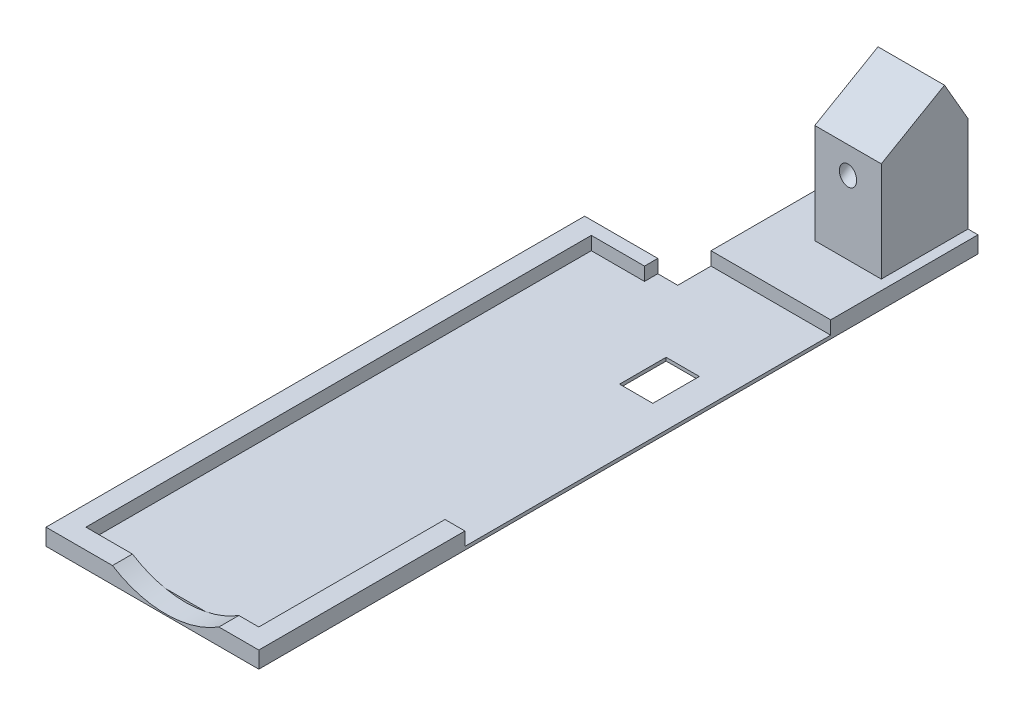
ISO-10303-21;
HEADER;
FILE_DESCRIPTION(('STEP AP214'),'2;1');
FILE_NAME('part.step','',(''),(''),'','','');
FILE_SCHEMA(('AUTOMOTIVE_DESIGN { 1 0 10303 214 1 1 1 1 }'));
ENDSEC;
DATA;
#1=APPLICATION_CONTEXT('core data for automotive mechanical design processes');
#2=APPLICATION_PROTOCOL_DEFINITION('international standard','automotive_design',2000,#1);
#3=PRODUCT_CONTEXT('',#1,'mechanical');
#4=PRODUCT('Part','Part','',(#3));
#5=PRODUCT_RELATED_PRODUCT_CATEGORY('part','',(#4));
#6=PRODUCT_DEFINITION_FORMATION('','',#4);
#7=PRODUCT_DEFINITION_CONTEXT('part definition',#1,'design');
#8=PRODUCT_DEFINITION('design','',#6,#7);
#9=PRODUCT_DEFINITION_SHAPE('','',#8);
#10=(LENGTH_UNIT() NAMED_UNIT(*) SI_UNIT(.MILLI.,.METRE.));
#11=(NAMED_UNIT(*) PLANE_ANGLE_UNIT() SI_UNIT($,.RADIAN.));
#12=(NAMED_UNIT(*) SI_UNIT($,.STERADIAN.) SOLID_ANGLE_UNIT());
#13=UNCERTAINTY_MEASURE_WITH_UNIT(LENGTH_MEASURE(1.E-05),#10,'distance_accuracy_value','');
#14=(GEOMETRIC_REPRESENTATION_CONTEXT(3) GLOBAL_UNCERTAINTY_ASSIGNED_CONTEXT((#13)) GLOBAL_UNIT_ASSIGNED_CONTEXT((#10,
#11,#12)) REPRESENTATION_CONTEXT('',''));
#15=CARTESIAN_POINT('',(0.,0.,0.));
#16=DIRECTION('',(0.,0.,1.));
#17=DIRECTION('',(1.,0.,0.));
#18=AXIS2_PLACEMENT_3D('',#15,#16,#17);
#19=CARTESIAN_POINT('',(0.,0.,0.));
#20=DIRECTION('',(0.,-1.,0.));
#21=DIRECTION('',(0.,0.,-1.));
#22=AXIS2_PLACEMENT_3D('',#19,#20,#21);
#23=PLANE('',#22);
#24=DIRECTION('',(0.,0.,1.));
#25=VECTOR('',#24,1.);
#26=CARTESIAN_POINT('',(11.5,0.,-32.15));
#27=LINE('',#26,#25);
#28=CARTESIAN_POINT('',(11.5,0.,45.));
#29=VERTEX_POINT('',#28);
#30=CARTESIAN_POINT('',(11.5,0.,76.));
#31=VERTEX_POINT('',#30);
#32=EDGE_CURVE('E322',#29,#31,#27,.T.);
#33=ORIENTED_EDGE('',*,*,#32,.F.);
#34=DIRECTION('',(1.,0.,0.));
#35=VECTOR('',#34,1.);
#36=CARTESIAN_POINT('',(11.5,0.,45.));
#37=LINE('',#36,#35);
#38=CARTESIAN_POINT('',(8.50000000000001,0.,45.));
#39=VERTEX_POINT('',#38);
#40=EDGE_CURVE('E231',#39,#29,#37,.T.);
#41=ORIENTED_EDGE('',*,*,#40,.F.);
#42=DIRECTION('',(0.,0.,-1.));
#43=VECTOR('',#42,1.);
#44=CARTESIAN_POINT('',(8.5,0.,-3.));
#45=LINE('',#44,#43);
#46=CARTESIAN_POINT('',(8.50000000000003,0.,73.));
#47=VERTEX_POINT('',#46);
#48=EDGE_CURVE('E315',#47,#39,#45,.T.);
#49=ORIENTED_EDGE('',*,*,#48,.F.);
#50=DIRECTION('',(1.,0.,0.));
#51=VECTOR('',#50,1.);
#52=CARTESIAN_POINT('',(8.50000000000003,0.,73.));
#53=LINE('',#52,#51);
#54=CARTESIAN_POINT('',(5.50000000000001,0.,73.));
#55=VERTEX_POINT('',#54);
#56=EDGE_CURVE('E311',#55,#47,#53,.T.);
#57=ORIENTED_EDGE('',*,*,#56,.F.);
#58=DIRECTION('',(0.,0.,-1.));
#59=VECTOR('',#58,1.);
#60=CARTESIAN_POINT('',(5.50000000000001,0.,78.));
#61=LINE('',#60,#59);
#62=CARTESIAN_POINT('',(5.50000000000001,0.,76.));
#63=VERTEX_POINT('',#62);
#64=EDGE_CURVE('E262',#63,#55,#61,.T.);
#65=ORIENTED_EDGE('',*,*,#64,.F.);
#66=DIRECTION('',(-1.,0.,0.));
#67=VECTOR('',#66,1.);
#68=CARTESIAN_POINT('',(11.5,0.,76.));
#69=LINE('',#68,#67);
#70=EDGE_CURVE('E345',#31,#63,#69,.T.);
#71=ORIENTED_EDGE('',*,*,#70,.F.);
#72=EDGE_LOOP('',(#33,#41,#49,#57,#65,#71));
#73=FACE_BOUND('',#72,.T.);
#74=ADVANCED_FACE('F32',(#73),#23,.F.);
#75=DIRECTION('',(-1.,0.,0.));
#76=VECTOR('',#75,1.);
#77=CARTESIAN_POINT('',(8.5,0.,-3.));
#78=LINE('',#77,#76);
#79=CARTESIAN_POINT('',(-9.5,0.,-3.));
#80=VERTEX_POINT('',#79);
#81=CARTESIAN_POINT('',(-17.5,0.,-3.));
#82=VERTEX_POINT('',#81);
#83=EDGE_CURVE('E300',#80,#82,#78,.T.);
#84=ORIENTED_EDGE('',*,*,#83,.F.);
#85=DIRECTION('',(0.,0.,1.));
#86=VECTOR('',#85,1.);
#87=CARTESIAN_POINT('',(-9.5,0.,-10.));
#88=LINE('',#87,#86);
#89=CARTESIAN_POINT('',(-9.5,0.,-5.));
#90=VERTEX_POINT('',#89);
#91=EDGE_CURVE('E539',#90,#80,#88,.T.);
#92=ORIENTED_EDGE('',*,*,#91,.F.);
#93=DIRECTION('',(1.,0.,0.));
#94=VECTOR('',#93,1.);
#95=CARTESIAN_POINT('',(-20.5,0.,-5.));
#96=LINE('',#95,#94);
#97=CARTESIAN_POINT('',(-20.5,0.,-5.));
#98=VERTEX_POINT('',#97);
#99=EDGE_CURVE('E350',#98,#90,#96,.T.);
#100=ORIENTED_EDGE('',*,*,#99,.F.);
#101=DIRECTION('',(0.,0.,-1.));
#102=VECTOR('',#101,1.);
#103=CARTESIAN_POINT('',(-20.5,0.,-5.));
#104=LINE('',#103,#102);
#105=CARTESIAN_POINT('',(-20.5,0.,76.));
#106=VERTEX_POINT('',#105);
#107=EDGE_CURVE('E348',#106,#98,#104,.T.);
#108=ORIENTED_EDGE('',*,*,#107,.F.);
#109=CARTESIAN_POINT('',(-10.5,0.,76.));
#110=VERTEX_POINT('',#109);
#111=EDGE_CURVE('E344',#110,#106,#69,.T.);
#112=ORIENTED_EDGE('',*,*,#111,.F.);
#113=DIRECTION('',(0.,0.,-1.));
#114=VECTOR('',#113,1.);
#115=CARTESIAN_POINT('',(-10.5,0.,78.));
#116=LINE('',#115,#114);
#117=CARTESIAN_POINT('',(-10.5,0.,73.));
#118=VERTEX_POINT('',#117);
#119=EDGE_CURVE('E260',#110,#118,#116,.T.);
#120=ORIENTED_EDGE('',*,*,#119,.T.);
#121=CARTESIAN_POINT('',(-17.5,0.,73.));
#122=VERTEX_POINT('',#121);
#123=EDGE_CURVE('E312',#122,#118,#53,.T.);
#124=ORIENTED_EDGE('',*,*,#123,.F.);
#125=DIRECTION('',(0.,0.,1.));
#126=VECTOR('',#125,1.);
#127=CARTESIAN_POINT('',(-17.5,0.,-3.));
#128=LINE('',#127,#126);
#129=EDGE_CURVE('E295',#82,#122,#128,.T.);
#130=ORIENTED_EDGE('',*,*,#129,.F.);
#131=EDGE_LOOP('',(#84,#92,#100,#108,#112,#120,#124,#130));
#132=FACE_BOUND('',#131,.T.);
#133=ADVANCED_FACE('F428',(#132),#23,.F.);
#134=CARTESIAN_POINT('',(8.50000000000003,-2.,73.));
#135=DIRECTION('',(0.,0.,1.));
#136=DIRECTION('',(1.,0.,0.));
#137=AXIS2_PLACEMENT_3D('',#134,#135,#136);
#138=PLANE('',#137);
#139=ORIENTED_EDGE('',*,*,#123,.T.);
#140=CARTESIAN_POINT('',(-2.49999999999999,12.6885775404495,73.));
#141=DIRECTION('',(0.,0.,-1.));
#142=DIRECTION('',(1.,0.,0.));
#143=AXIS2_PLACEMENT_3D('',#140,#141,#142);
#144=CIRCLE('',#143,15.);
#145=CARTESIAN_POINT('',(-5.54067259635132,-2.,73.));
#146=VERTEX_POINT('',#145);
#147=EDGE_CURVE('E258',#146,#118,#144,.T.);
#148=ORIENTED_EDGE('',*,*,#147,.F.);
#149=DIRECTION('',(1.,0.,0.));
#150=VECTOR('',#149,1.);
#151=CARTESIAN_POINT('',(8.50000000000003,-2.,73.));
#152=LINE('',#151,#150);
#153=CARTESIAN_POINT('',(-17.5,-2.,73.));
#154=VERTEX_POINT('',#153);
#155=EDGE_CURVE('E301',#154,#146,#152,.T.);
#156=ORIENTED_EDGE('',*,*,#155,.F.);
#157=DIRECTION('',(0.,1.,0.));
#158=VECTOR('',#157,1.);
#159=CARTESIAN_POINT('',(-17.5,-2.,73.));
#160=LINE('',#159,#158);
#161=EDGE_CURVE('E309',#154,#122,#160,.T.);
#162=ORIENTED_EDGE('',*,*,#161,.T.);
#163=EDGE_LOOP('',(#139,#148,#156,#162));
#164=FACE_BOUND('',#163,.T.);
#165=ADVANCED_FACE('F437',(#164),#138,.F.);
#166=CARTESIAN_POINT('',(10.,20.5,-28.6147367081371));
#167=DIRECTION('',(0.,-0.500000000000002,0.866025403784438));
#168=DIRECTION('',(0.,-0.866025403784438,-0.500000000000002));
#169=AXIS2_PLACEMENT_3D('',#166,#167,#168);
#170=PLANE('',#169);
#171=CARTESIAN_POINT('',(5.,17.4689110867545,-30.3647367081371));
#172=DIRECTION('',(0.,0.500000000000001,-0.866025403784438));
#173=DIRECTION('',(0.,0.866025403784438,0.500000000000001));
#174=AXIS2_PLACEMENT_3D('',#171,#172,#173);
#175=CIRCLE('',#174,1.75);
#176=CARTESIAN_POINT('',(5.,18.9844555433773,-29.4897367081371));
#177=VERTEX_POINT('',#176);
#178=EDGE_CURVE('E372',#177,#177,#175,.T.);
#179=ORIENTED_EDGE('',*,*,#178,.F.);
#180=EDGE_LOOP('',(#179));
#181=FACE_BOUND('',#180,.T.);
#182=DIRECTION('',(0.,0.866025403784438,0.500000000000002));
#183=VECTOR('',#182,1.);
#184=CARTESIAN_POINT('',(0.,20.5,-28.6147367081371));
#185=LINE('',#184,#183);
#186=CARTESIAN_POINT('',(0.,14.3772003952441,-32.1497367081371));
#187=VERTEX_POINT('',#186);
#188=CARTESIAN_POINT('',(0.,20.5,-28.6147367081371));
#189=VERTEX_POINT('',#188);
#190=EDGE_CURVE('E389',#187,#189,#185,.T.);
#191=ORIENTED_EDGE('',*,*,#190,.T.);
#192=DIRECTION('',(-1.,0.,0.));
#193=VECTOR('',#192,1.);
#194=CARTESIAN_POINT('',(10.,20.5,-28.6147367081371));
#195=LINE('',#194,#193);
#196=CARTESIAN_POINT('',(10.,20.5,-28.6147367081371));
#197=VERTEX_POINT('',#196);
#198=EDGE_CURVE('E40',#197,#189,#195,.T.);
#199=ORIENTED_EDGE('',*,*,#198,.F.);
#200=DIRECTION('',(0.,0.866025403784438,0.500000000000002));
#201=VECTOR('',#200,1.);
#202=CARTESIAN_POINT('',(10.,20.5,-28.6147367081371));
#203=LINE('',#202,#201);
#204=CARTESIAN_POINT('',(10.,14.3772003952441,-32.1497367081371));
#205=VERTEX_POINT('',#204);
#206=EDGE_CURVE('E376',#205,#197,#203,.T.);
#207=ORIENTED_EDGE('',*,*,#206,.F.);
#208=DIRECTION('',(-1.,0.,0.));
#209=VECTOR('',#208,1.);
#210=CARTESIAN_POINT('',(10.,14.3772003952441,-32.1497367081371));
#211=LINE('',#210,#209);
#212=EDGE_CURVE('E388',#205,#187,#211,.T.);
#213=ORIENTED_EDGE('',*,*,#212,.T.);
#214=EDGE_LOOP('',(#191,#199,#207,#213));
#215=FACE_BOUND('',#214,.T.);
#216=ADVANCED_FACE('F477',(#181,#215),#170,.F.);
#217=CARTESIAN_POINT('',(10.,15.0101950089539,-19.10611554));
#218=DIRECTION('',(0.,-0.866025403784438,-0.500000000000001));
#219=DIRECTION('',(0.,0.500000000000001,-0.866025403784438));
#220=AXIS2_PLACEMENT_3D('',#217,#218,#219);
#221=PLANE('',#220);
#222=DIRECTION('',(0.,-0.500000000000001,0.866025403784438));
#223=VECTOR('',#222,1.);
#224=CARTESIAN_POINT('',(0.,15.0101950089539,-19.10611554));
#225=LINE('',#224,#223);
#226=CARTESIAN_POINT('',(0.,15.0101950089539,-19.10611554));
#227=VERTEX_POINT('',#226);
#228=EDGE_CURVE('E392',#189,#227,#225,.T.);
#229=ORIENTED_EDGE('',*,*,#228,.T.);
#230=DIRECTION('',(-1.,0.,0.));
#231=VECTOR('',#230,1.);
#232=CARTESIAN_POINT('',(10.,15.0101950089539,-19.10611554));
#233=LINE('',#232,#231);
#234=CARTESIAN_POINT('',(10.,15.0101950089539,-19.10611554));
#235=VERTEX_POINT('',#234);
#236=EDGE_CURVE('E408',#235,#227,#233,.T.);
#237=ORIENTED_EDGE('',*,*,#236,.F.);
#238=DIRECTION('',(0.,-0.500000000000001,0.866025403784438));
#239=VECTOR('',#238,1.);
#240=CARTESIAN_POINT('',(10.,15.0101950089539,-19.10611554));
#241=LINE('',#240,#239);
#242=EDGE_CURVE('E379',#197,#235,#241,.T.);
#243=ORIENTED_EDGE('',*,*,#242,.F.);
#244=ORIENTED_EDGE('',*,*,#198,.T.);
#245=EDGE_LOOP('',(#229,#237,#243,#244));
#246=FACE_BOUND('',#245,.T.);
#247=ADVANCED_FACE('F475',(#246),#221,.F.);
#248=CARTESIAN_POINT('',(10.,15.0101950089539,-19.10611554));
#249=DIRECTION('',(0.,0.,-1.));
#250=DIRECTION('',(0.,1.,0.));
#251=AXIS2_PLACEMENT_3D('',#248,#249,#250);
#252=PLANE('',#251);
#253=CARTESIAN_POINT('',(5.,10.9989273641986,-19.10611554));
#254=DIRECTION('',(0.,0.,-1.));
#255=DIRECTION('',(0.,1.,0.));
#256=AXIS2_PLACEMENT_3D('',#253,#254,#255);
#257=ELLIPSE('',#256,1.4971215493728,1.29628175330766);
#258=CARTESIAN_POINT('',(5.,12.4960489135714,-19.10611554));
#259=VERTEX_POINT('',#258);
#260=EDGE_CURVE('E375',#259,#259,#257,.T.);
#261=ORIENTED_EDGE('',*,*,#260,.T.);
#262=EDGE_LOOP('',(#261));
#263=FACE_BOUND('',#262,.T.);
#264=DIRECTION('',(0.,-1.,0.));
#265=VECTOR('',#264,1.);
#266=CARTESIAN_POINT('',(0.,15.0101950089539,-19.10611554));
#267=LINE('',#266,#265);
#268=CARTESIAN_POINT('',(0.,0.,-19.10611554));
#269=VERTEX_POINT('',#268);
#270=EDGE_CURVE('E394',#227,#269,#267,.T.);
#271=ORIENTED_EDGE('',*,*,#270,.T.);
#272=DIRECTION('',(-1.,0.,0.));
#273=VECTOR('',#272,1.);
#274=CARTESIAN_POINT('',(10.,0.,-19.10611554));
#275=LINE('',#274,#273);
#276=CARTESIAN_POINT('',(10.,0.,-19.10611554));
#277=VERTEX_POINT('',#276);
#278=EDGE_CURVE('E405',#277,#269,#275,.T.);
#279=ORIENTED_EDGE('',*,*,#278,.F.);
#280=DIRECTION('',(0.,-1.,0.));
#281=VECTOR('',#280,1.);
#282=CARTESIAN_POINT('',(10.,15.0101950089539,-19.10611554));
#283=LINE('',#282,#281);
#284=EDGE_CURVE('E382',#235,#277,#283,.T.);
#285=ORIENTED_EDGE('',*,*,#284,.F.);
#286=ORIENTED_EDGE('',*,*,#236,.T.);
#287=EDGE_LOOP('',(#271,#279,#285,#286));
#288=FACE_BOUND('',#287,.T.);
#289=ADVANCED_FACE('F415',(#263,#288),#252,.F.);
#290=CARTESIAN_POINT('',(10.,14.3772003952441,-32.1497367081371));
#291=DIRECTION('',(0.,0.,1.));
#292=DIRECTION('',(0.,-1.,0.));
#293=AXIS2_PLACEMENT_3D('',#290,#291,#292);
#294=PLANE('',#293);
#295=DIRECTION('',(0.,1.,0.));
#296=VECTOR('',#295,1.);
#297=CARTESIAN_POINT('',(0.,14.3772003952441,-32.1497367081371));
#298=LINE('',#297,#296);
#299=CARTESIAN_POINT('',(0.,0.,-32.1497367081371));
#300=VERTEX_POINT('',#299);
#301=EDGE_CURVE('E380',#300,#187,#298,.T.);
#302=ORIENTED_EDGE('',*,*,#301,.T.);
#303=ORIENTED_EDGE('',*,*,#212,.F.);
#304=DIRECTION('',(0.,1.,0.));
#305=VECTOR('',#304,1.);
#306=CARTESIAN_POINT('',(10.,14.3772003952441,-32.1497367081371));
#307=LINE('',#306,#305);
#308=CARTESIAN_POINT('',(10.,0.,-32.1497367081371));
#309=VERTEX_POINT('',#308);
#310=EDGE_CURVE('E386',#309,#205,#307,.T.);
#311=ORIENTED_EDGE('',*,*,#310,.F.);
#312=DIRECTION('',(-1.,0.,0.));
#313=VECTOR('',#312,1.);
#314=CARTESIAN_POINT('',(10.,0.,-32.1497367081371));
#315=LINE('',#314,#313);
#316=EDGE_CURVE('E403',#309,#300,#315,.T.);
#317=ORIENTED_EDGE('',*,*,#316,.T.);
#318=EDGE_LOOP('',(#302,#303,#311,#317));
#319=FACE_BOUND('',#318,.T.);
#320=ADVANCED_FACE('F467',(#319),#294,.F.);
#321=CARTESIAN_POINT('',(10.,0.,0.));
#322=DIRECTION('',(1.,0.,0.));
#323=DIRECTION('',(0.,0.,-1.));
#324=AXIS2_PLACEMENT_3D('',#321,#322,#323);
#325=PLANE('',#324);
#326=ORIENTED_EDGE('',*,*,#206,.T.);
#327=ORIENTED_EDGE('',*,*,#242,.T.);
#328=ORIENTED_EDGE('',*,*,#284,.T.);
#329=DIRECTION('',(0.,0.,-1.));
#330=VECTOR('',#329,1.);
#331=CARTESIAN_POINT('',(10.,0.,-32.1497367081371));
#332=LINE('',#331,#330);
#333=EDGE_CURVE('E384',#277,#309,#332,.T.);
#334=ORIENTED_EDGE('',*,*,#333,.T.);
#335=ORIENTED_EDGE('',*,*,#310,.T.);
#336=EDGE_LOOP('',(#326,#327,#328,#334,#335));
#337=FACE_BOUND('',#336,.T.);
#338=ADVANCED_FACE('F429',(#337),#325,.T.);
#339=CARTESIAN_POINT('',(0.,0.,0.));
#340=DIRECTION('',(1.,0.,0.));
#341=DIRECTION('',(0.,0.,-1.));
#342=AXIS2_PLACEMENT_3D('',#339,#340,#341);
#343=PLANE('',#342);
#344=ORIENTED_EDGE('',*,*,#190,.F.);
#345=ORIENTED_EDGE('',*,*,#301,.F.);
#346=DIRECTION('',(0.,0.,-1.));
#347=VECTOR('',#346,1.);
#348=CARTESIAN_POINT('',(0.,0.,-32.1497367081371));
#349=LINE('',#348,#347);
#350=EDGE_CURVE('E397',#269,#300,#349,.T.);
#351=ORIENTED_EDGE('',*,*,#350,.F.);
#352=ORIENTED_EDGE('',*,*,#270,.F.);
#353=ORIENTED_EDGE('',*,*,#228,.F.);
#354=EDGE_LOOP('',(#344,#345,#351,#352,#353));
#355=FACE_BOUND('',#354,.T.);
#356=ADVANCED_FACE('F420',(#355),#343,.F.);
#357=CARTESIAN_POINT('',(5.,17.4689110867545,-30.3647367081371));
#358=DIRECTION('',(0.,0.500000000000002,-0.866025403784438));
#359=DIRECTION('',(0.,0.866025403784438,0.500000000000001));
#360=AXIS2_PLACEMENT_3D('',#357,#358,#359);
#361=CONICAL_SURFACE('',#360,1.75,0.0349065850398866);
#362=ORIENTED_EDGE('',*,*,#178,.T.);
#363=EDGE_LOOP('',(#362));
#364=FACE_BOUND('',#363,.T.);
#365=ORIENTED_EDGE('',*,*,#260,.F.);
#366=EDGE_LOOP('',(#365));
#367=FACE_BOUND('',#366,.T.);
#368=ADVANCED_FACE('F34',(#364,#367),#361,.F.);
#369=DIRECTION('',(0.,0.,-1.));
#370=VECTOR('',#369,1.);
#371=CARTESIAN_POINT('',(-6.5,0.,-5.));
#372=LINE('',#371,#370);
#373=CARTESIAN_POINT('',(-6.5,0.,-10.));
#374=VERTEX_POINT('',#373);
#375=CARTESIAN_POINT('',(-6.5,0.,-32.15));
#376=VERTEX_POINT('',#375);
#377=EDGE_CURVE('E353',#374,#376,#372,.T.);
#378=ORIENTED_EDGE('',*,*,#377,.F.);
#379=DIRECTION('',(-1.,0.,0.));
#380=VECTOR('',#379,1.);
#381=CARTESIAN_POINT('',(11.5,0.,-10.));
#382=LINE('',#381,#380);
#383=CARTESIAN_POINT('',(11.5,0.,-10.));
#384=VERTEX_POINT('',#383);
#385=EDGE_CURVE('E540',#384,#374,#382,.T.);
#386=ORIENTED_EDGE('',*,*,#385,.F.);
#387=CARTESIAN_POINT('',(11.5,0.,-32.15));
#388=VERTEX_POINT('',#387);
#389=EDGE_CURVE('E237',#388,#384,#27,.T.);
#390=ORIENTED_EDGE('',*,*,#389,.F.);
#391=DIRECTION('',(1.,0.,0.));
#392=VECTOR('',#391,1.);
#393=CARTESIAN_POINT('',(-6.5,0.,-32.15));
#394=LINE('',#393,#392);
#395=EDGE_CURVE('E332',#376,#388,#394,.T.);
#396=ORIENTED_EDGE('',*,*,#395,.F.);
#397=EDGE_LOOP('',(#378,#386,#390,#396));
#398=FACE_BOUND('',#397,.T.);
#399=ORIENTED_EDGE('',*,*,#278,.T.);
#400=ORIENTED_EDGE('',*,*,#350,.T.);
#401=ORIENTED_EDGE('',*,*,#316,.F.);
#402=ORIENTED_EDGE('',*,*,#333,.F.);
#403=EDGE_LOOP('',(#399,#400,#401,#402));
#404=FACE_BOUND('',#403,.T.);
#405=ADVANCED_FACE('F419',(#398,#404),#23,.F.);
#406=CARTESIAN_POINT('',(11.5,-2.5,-32.15));
#407=DIRECTION('',(-1.,0.,0.));
#408=DIRECTION('',(0.,0.,1.));
#409=AXIS2_PLACEMENT_3D('',#406,#407,#408);
#410=PLANE('',#409);
#411=DIRECTION('',(0.,0.,-1.));
#412=VECTOR('',#411,1.);
#413=CARTESIAN_POINT('',(11.5,-2.,-10.));
#414=LINE('',#413,#412);
#415=CARTESIAN_POINT('',(11.5,-2.00000000000001,45.));
#416=VERTEX_POINT('',#415);
#417=CARTESIAN_POINT('',(11.5,-2.,-10.));
#418=VERTEX_POINT('',#417);
#419=EDGE_CURVE('E220',#416,#418,#414,.T.);
#420=ORIENTED_EDGE('',*,*,#419,.F.);
#421=DIRECTION('',(0.,1.,0.));
#422=VECTOR('',#421,1.);
#423=CARTESIAN_POINT('',(11.5,-2.00000000000001,45.));
#424=LINE('',#423,#422);
#425=EDGE_CURVE('E238',#416,#29,#424,.T.);
#426=ORIENTED_EDGE('',*,*,#425,.T.);
#427=ORIENTED_EDGE('',*,*,#32,.T.);
#428=DIRECTION('',(0.,1.,0.));
#429=VECTOR('',#428,1.);
#430=CARTESIAN_POINT('',(11.5,-2.50000000000001,76.));
#431=LINE('',#430,#429);
#432=CARTESIAN_POINT('',(11.5,-2.50000000000001,76.));
#433=VERTEX_POINT('',#432);
#434=EDGE_CURVE('E369',#433,#31,#431,.T.);
#435=ORIENTED_EDGE('',*,*,#434,.F.);
#436=DIRECTION('',(0.,0.,1.));
#437=VECTOR('',#436,1.);
#438=CARTESIAN_POINT('',(11.5,-2.5,-32.15));
#439=LINE('',#438,#437);
#440=CARTESIAN_POINT('',(11.5,-2.5,-32.15));
#441=VERTEX_POINT('',#440);
#442=EDGE_CURVE('E328',#441,#433,#439,.T.);
#443=ORIENTED_EDGE('',*,*,#442,.F.);
#444=DIRECTION('',(0.,1.,0.));
#445=VECTOR('',#444,1.);
#446=CARTESIAN_POINT('',(11.5,-2.5,-32.15));
#447=LINE('',#446,#445);
#448=EDGE_CURVE('E342',#441,#388,#447,.T.);
#449=ORIENTED_EDGE('',*,*,#448,.T.);
#450=ORIENTED_EDGE('',*,*,#389,.T.);
#451=DIRECTION('',(0.,1.,0.));
#452=VECTOR('',#451,1.);
#453=CARTESIAN_POINT('',(11.5,-2.,-10.));
#454=LINE('',#453,#452);
#455=EDGE_CURVE('E215',#418,#384,#454,.T.);
#456=ORIENTED_EDGE('',*,*,#455,.F.);
#457=EDGE_LOOP('',(#420,#426,#427,#435,#443,#449,#450,#456));
#458=FACE_BOUND('',#457,.T.);
#459=ADVANCED_FACE('F234',(#458),#410,.F.);
#460=CARTESIAN_POINT('',(11.5,-2.50000000000001,76.));
#461=DIRECTION('',(0.,0.,-1.));
#462=DIRECTION('',(-1.,0.,0.));
#463=AXIS2_PLACEMENT_3D('',#460,#461,#462);
#464=PLANE('',#463);
#465=ORIENTED_EDGE('',*,*,#70,.T.);
#466=CARTESIAN_POINT('',(-2.49999999999999,12.6885775404495,76.));
#467=DIRECTION('',(0.,0.,-1.));
#468=DIRECTION('',(-1.,0.,0.));
#469=AXIS2_PLACEMENT_3D('',#466,#467,#468);
#470=CIRCLE('',#469,15.);
#471=EDGE_CURVE('E264',#63,#110,#470,.T.);
#472=ORIENTED_EDGE('',*,*,#471,.T.);
#473=ORIENTED_EDGE('',*,*,#111,.T.);
#474=DIRECTION('',(0.,1.,0.));
#475=VECTOR('',#474,1.);
#476=CARTESIAN_POINT('',(-20.5,-2.50000000000001,76.));
#477=LINE('',#476,#475);
#478=CARTESIAN_POINT('',(-20.5,-2.50000000000001,76.));
#479=VERTEX_POINT('',#478);
#480=EDGE_CURVE('E366',#479,#106,#477,.T.);
#481=ORIENTED_EDGE('',*,*,#480,.F.);
#482=DIRECTION('',(-1.,0.,0.));
#483=VECTOR('',#482,1.);
#484=CARTESIAN_POINT('',(11.5,-2.50000000000001,76.));
#485=LINE('',#484,#483);
#486=EDGE_CURVE('E331',#433,#479,#485,.T.);
#487=ORIENTED_EDGE('',*,*,#486,.F.);
#488=ORIENTED_EDGE('',*,*,#434,.T.);
#489=EDGE_LOOP('',(#465,#472,#473,#481,#487,#488));
#490=FACE_BOUND('',#489,.T.);
#491=ADVANCED_FACE('F459',(#490),#464,.F.);
#492=CARTESIAN_POINT('',(-20.5,-2.5,-5.));
#493=DIRECTION('',(1.,0.,0.));
#494=DIRECTION('',(0.,0.,-1.));
#495=AXIS2_PLACEMENT_3D('',#492,#493,#494);
#496=PLANE('',#495);
#497=ORIENTED_EDGE('',*,*,#107,.T.);
#498=DIRECTION('',(0.,1.,0.));
#499=VECTOR('',#498,1.);
#500=CARTESIAN_POINT('',(-20.5,-2.5,-5.));
#501=LINE('',#500,#499);
#502=CARTESIAN_POINT('',(-20.5,-2.5,-5.));
#503=VERTEX_POINT('',#502);
#504=EDGE_CURVE('E363',#503,#98,#501,.T.);
#505=ORIENTED_EDGE('',*,*,#504,.F.);
#506=DIRECTION('',(0.,0.,-1.));
#507=VECTOR('',#506,1.);
#508=CARTESIAN_POINT('',(-20.5,-2.5,-5.));
#509=LINE('',#508,#507);
#510=EDGE_CURVE('E334',#479,#503,#509,.T.);
#511=ORIENTED_EDGE('',*,*,#510,.F.);
#512=ORIENTED_EDGE('',*,*,#480,.T.);
#513=EDGE_LOOP('',(#497,#505,#511,#512));
#514=FACE_BOUND('',#513,.T.);
#515=ADVANCED_FACE('F455',(#514),#496,.F.);
#516=CARTESIAN_POINT('',(-20.5,-2.5,-5.));
#517=DIRECTION('',(0.,0.,1.));
#518=DIRECTION('',(0.,-1.,0.));
#519=AXIS2_PLACEMENT_3D('',#516,#517,#518);
#520=PLANE('',#519);
#521=ORIENTED_EDGE('',*,*,#99,.T.);
#522=DIRECTION('',(0.,-1.,0.));
#523=VECTOR('',#522,1.);
#524=CARTESIAN_POINT('',(-9.5,-2.5,-5.));
#525=LINE('',#524,#523);
#526=CARTESIAN_POINT('',(-9.5,-2.,-5.));
#527=VERTEX_POINT('',#526);
#528=EDGE_CURVE('E252',#90,#527,#525,.T.);
#529=ORIENTED_EDGE('',*,*,#528,.T.);
#530=DIRECTION('',(1.,0.,0.));
#531=VECTOR('',#530,1.);
#532=CARTESIAN_POINT('',(-20.5,-2.,-5.));
#533=LINE('',#532,#531);
#534=CARTESIAN_POINT('',(-6.5,-2.,-5.));
#535=VERTEX_POINT('',#534);
#536=EDGE_CURVE('E246',#527,#535,#533,.T.);
#537=ORIENTED_EDGE('',*,*,#536,.T.);
#538=DIRECTION('',(0.,1.,0.));
#539=VECTOR('',#538,1.);
#540=CARTESIAN_POINT('',(-6.5,-2.5,-5.));
#541=LINE('',#540,#539);
#542=CARTESIAN_POINT('',(-6.5,-2.5,-5.));
#543=VERTEX_POINT('',#542);
#544=EDGE_CURVE('E360',#543,#535,#541,.T.);
#545=ORIENTED_EDGE('',*,*,#544,.F.);
#546=DIRECTION('',(1.,0.,0.));
#547=VECTOR('',#546,1.);
#548=CARTESIAN_POINT('',(-20.5,-2.5,-5.));
#549=LINE('',#548,#547);
#550=EDGE_CURVE('E336',#503,#543,#549,.T.);
#551=ORIENTED_EDGE('',*,*,#550,.F.);
#552=ORIENTED_EDGE('',*,*,#504,.T.);
#553=EDGE_LOOP('',(#521,#529,#537,#545,#551,#552));
#554=FACE_BOUND('',#553,.T.);
#555=ADVANCED_FACE('F451',(#554),#520,.F.);
#556=CARTESIAN_POINT('',(-6.5,-2.5,-5.));
#557=DIRECTION('',(1.,0.,0.));
#558=DIRECTION('',(0.,0.,-1.));
#559=AXIS2_PLACEMENT_3D('',#556,#557,#558);
#560=PLANE('',#559);
#561=DIRECTION('',(0.,0.,-1.));
#562=VECTOR('',#561,1.);
#563=CARTESIAN_POINT('',(-6.5,-2.,-5.));
#564=LINE('',#563,#562);
#565=CARTESIAN_POINT('',(-6.5,-2.,-10.));
#566=VERTEX_POINT('',#565);
#567=EDGE_CURVE('E240',#535,#566,#564,.T.);
#568=ORIENTED_EDGE('',*,*,#567,.T.);
#569=DIRECTION('',(0.,1.,0.));
#570=VECTOR('',#569,1.);
#571=CARTESIAN_POINT('',(-6.5,-2.5,-10.));
#572=LINE('',#571,#570);
#573=EDGE_CURVE('E11',#566,#374,#572,.T.);
#574=ORIENTED_EDGE('',*,*,#573,.T.);
#575=ORIENTED_EDGE('',*,*,#377,.T.);
#576=DIRECTION('',(0.,1.,0.));
#577=VECTOR('',#576,1.);
#578=CARTESIAN_POINT('',(-6.5,-2.5,-32.15));
#579=LINE('',#578,#577);
#580=CARTESIAN_POINT('',(-6.5,-2.5,-32.15));
#581=VERTEX_POINT('',#580);
#582=EDGE_CURVE('E357',#581,#376,#579,.T.);
#583=ORIENTED_EDGE('',*,*,#582,.F.);
#584=DIRECTION('',(0.,0.,-1.));
#585=VECTOR('',#584,1.);
#586=CARTESIAN_POINT('',(-6.5,-2.5,-5.));
#587=LINE('',#586,#585);
#588=EDGE_CURVE('E338',#543,#581,#587,.T.);
#589=ORIENTED_EDGE('',*,*,#588,.F.);
#590=ORIENTED_EDGE('',*,*,#544,.T.);
#591=EDGE_LOOP('',(#568,#574,#575,#583,#589,#590));
#592=FACE_BOUND('',#591,.T.);
#593=ADVANCED_FACE('F447',(#592),#560,.F.);
#594=CARTESIAN_POINT('',(-6.5,-2.5,-32.15));
#595=DIRECTION('',(0.,0.,1.));
#596=DIRECTION('',(1.,0.,0.));
#597=AXIS2_PLACEMENT_3D('',#594,#595,#596);
#598=PLANE('',#597);
#599=ORIENTED_EDGE('',*,*,#395,.T.);
#600=ORIENTED_EDGE('',*,*,#448,.F.);
#601=DIRECTION('',(1.,0.,0.));
#602=VECTOR('',#601,1.);
#603=CARTESIAN_POINT('',(-6.5,-2.5,-32.15));
#604=LINE('',#603,#602);
#605=EDGE_CURVE('E340',#581,#441,#604,.T.);
#606=ORIENTED_EDGE('',*,*,#605,.F.);
#607=ORIENTED_EDGE('',*,*,#582,.T.);
#608=EDGE_LOOP('',(#599,#600,#606,#607));
#609=FACE_BOUND('',#608,.T.);
#610=ADVANCED_FACE('F444',(#609),#598,.F.);
#611=CARTESIAN_POINT('',(0.,-2.5,0.));
#612=DIRECTION('',(0.,-1.,0.));
#613=DIRECTION('',(0.,0.,-1.));
#614=AXIS2_PLACEMENT_3D('',#611,#612,#613);
#615=PLANE('',#614);
#616=DIRECTION('',(0.,0.,1.));
#617=VECTOR('',#616,1.);
#618=CARTESIAN_POINT('',(7.00000000000003,-2.5,0.));
#619=LINE('',#618,#617);
#620=CARTESIAN_POINT('',(7.00000000000003,-2.5,5.25));
#621=VERTEX_POINT('',#620);
#622=CARTESIAN_POINT('',(7.00000000000003,-2.5,12.25));
#623=VERTEX_POINT('',#622);
#624=EDGE_CURVE('E293',#621,#623,#619,.T.);
#625=ORIENTED_EDGE('',*,*,#624,.F.);
#626=DIRECTION('',(1.,0.,0.));
#627=VECTOR('',#626,1.);
#628=CARTESIAN_POINT('',(0.,-2.5,5.25));
#629=LINE('',#628,#627);
#630=CARTESIAN_POINT('',(2.00000000000003,-2.5,5.25));
#631=VERTEX_POINT('',#630);
#632=EDGE_CURVE('E282',#631,#621,#629,.T.);
#633=ORIENTED_EDGE('',*,*,#632,.F.);
#634=DIRECTION('',(0.,0.,-1.));
#635=VECTOR('',#634,1.);
#636=CARTESIAN_POINT('',(2.00000000000003,-2.5,0.));
#637=LINE('',#636,#635);
#638=CARTESIAN_POINT('',(2.00000000000003,-2.5,12.25));
#639=VERTEX_POINT('',#638);
#640=EDGE_CURVE('E289',#639,#631,#637,.T.);
#641=ORIENTED_EDGE('',*,*,#640,.F.);
#642=DIRECTION('',(-1.,0.,0.));
#643=VECTOR('',#642,1.);
#644=CARTESIAN_POINT('',(0.,-2.5,12.25));
#645=LINE('',#644,#643);
#646=EDGE_CURVE('E291',#623,#639,#645,.T.);
#647=ORIENTED_EDGE('',*,*,#646,.F.);
#648=EDGE_LOOP('',(#625,#633,#641,#647));
#649=FACE_BOUND('',#648,.T.);
#650=ORIENTED_EDGE('',*,*,#442,.T.);
#651=ORIENTED_EDGE('',*,*,#486,.T.);
#652=ORIENTED_EDGE('',*,*,#510,.T.);
#653=ORIENTED_EDGE('',*,*,#550,.T.);
#654=ORIENTED_EDGE('',*,*,#588,.T.);
#655=ORIENTED_EDGE('',*,*,#605,.T.);
#656=EDGE_LOOP('',(#650,#651,#652,#653,#654,#655));
#657=FACE_BOUND('',#656,.T.);
#658=ADVANCED_FACE('F442',(#649,#657),#615,.T.);
#659=CARTESIAN_POINT('',(-17.5,-2.,-3.));
#660=DIRECTION('',(-1.,0.,0.));
#661=DIRECTION('',(0.,0.,1.));
#662=AXIS2_PLACEMENT_3D('',#659,#660,#661);
#663=PLANE('',#662);
#664=ORIENTED_EDGE('',*,*,#129,.T.);
#665=ORIENTED_EDGE('',*,*,#161,.F.);
#666=DIRECTION('',(0.,0.,1.));
#667=VECTOR('',#666,1.);
#668=CARTESIAN_POINT('',(-17.5,-2.,-3.));
#669=LINE('',#668,#667);
#670=CARTESIAN_POINT('',(-17.5,-2.,-3.));
#671=VERTEX_POINT('',#670);
#672=EDGE_CURVE('E296',#671,#154,#669,.T.);
#673=ORIENTED_EDGE('',*,*,#672,.F.);
#674=DIRECTION('',(0.,1.,0.));
#675=VECTOR('',#674,1.);
#676=CARTESIAN_POINT('',(-17.5,-2.,-3.));
#677=LINE('',#676,#675);
#678=EDGE_CURVE('E319',#671,#82,#677,.T.);
#679=ORIENTED_EDGE('',*,*,#678,.T.);
#680=EDGE_LOOP('',(#664,#665,#673,#679));
#681=FACE_BOUND('',#680,.T.);
#682=ADVANCED_FACE('F551',(#681),#663,.F.);
#683=CARTESIAN_POINT('',(8.5,-2.,-3.));
#684=DIRECTION('',(0.,0.,-1.));
#685=DIRECTION('',(-1.,0.,0.));
#686=AXIS2_PLACEMENT_3D('',#683,#684,#685);
#687=PLANE('',#686);
#688=DIRECTION('',(-1.,0.,0.));
#689=VECTOR('',#688,1.);
#690=CARTESIAN_POINT('',(8.5,-2.,-3.));
#691=LINE('',#690,#689);
#692=CARTESIAN_POINT('',(-9.5,-2.,-3.));
#693=VERTEX_POINT('',#692);
#694=EDGE_CURVE('E307',#693,#671,#691,.T.);
#695=ORIENTED_EDGE('',*,*,#694,.F.);
#696=DIRECTION('',(0.,1.,0.));
#697=VECTOR('',#696,1.);
#698=CARTESIAN_POINT('',(-9.5,-2.,-3.));
#699=LINE('',#698,#697);
#700=EDGE_CURVE('E249',#693,#80,#699,.T.);
#701=ORIENTED_EDGE('',*,*,#700,.T.);
#702=ORIENTED_EDGE('',*,*,#83,.T.);
#703=ORIENTED_EDGE('',*,*,#678,.F.);
#704=EDGE_LOOP('',(#695,#701,#702,#703));
#705=FACE_BOUND('',#704,.T.);
#706=ADVANCED_FACE('F514',(#705),#687,.F.);
#707=CARTESIAN_POINT('',(8.5,-2.,-3.));
#708=DIRECTION('',(1.,0.,0.));
#709=DIRECTION('',(0.,0.,-1.));
#710=AXIS2_PLACEMENT_3D('',#707,#708,#709);
#711=PLANE('',#710);
#712=ORIENTED_EDGE('',*,*,#48,.T.);
#713=DIRECTION('',(0.,-1.,0.));
#714=VECTOR('',#713,1.);
#715=CARTESIAN_POINT('',(8.50000000000002,-2.00000000000001,45.));
#716=LINE('',#715,#714);
#717=CARTESIAN_POINT('',(8.50000000000003,-2.00000000000001,45.));
#718=VERTEX_POINT('',#717);
#719=EDGE_CURVE('E255',#39,#718,#716,.T.);
#720=ORIENTED_EDGE('',*,*,#719,.T.);
#721=DIRECTION('',(0.,0.,-1.));
#722=VECTOR('',#721,1.);
#723=CARTESIAN_POINT('',(8.5,-2.,-3.));
#724=LINE('',#723,#722);
#725=CARTESIAN_POINT('',(8.50000000000003,-2.,73.));
#726=VERTEX_POINT('',#725);
#727=EDGE_CURVE('E304',#726,#718,#724,.T.);
#728=ORIENTED_EDGE('',*,*,#727,.F.);
#729=DIRECTION('',(0.,1.,0.));
#730=VECTOR('',#729,1.);
#731=CARTESIAN_POINT('',(8.50000000000003,-2.,73.));
#732=LINE('',#731,#730);
#733=EDGE_CURVE('E323',#726,#47,#732,.T.);
#734=ORIENTED_EDGE('',*,*,#733,.T.);
#735=EDGE_LOOP('',(#712,#720,#728,#734));
#736=FACE_BOUND('',#735,.T.);
#737=ADVANCED_FACE('F506',(#736),#711,.F.);
#738=CARTESIAN_POINT('',(0.540672596351342,-2.,73.));
#739=VERTEX_POINT('',#738);
#740=EDGE_CURVE('E299',#739,#726,#152,.T.);
#741=ORIENTED_EDGE('',*,*,#740,.F.);
#742=EDGE_CURVE('E47',#55,#739,#144,.T.);
#743=ORIENTED_EDGE('',*,*,#742,.F.);
#744=ORIENTED_EDGE('',*,*,#56,.T.);
#745=ORIENTED_EDGE('',*,*,#733,.F.);
#746=EDGE_LOOP('',(#741,#743,#744,#745));
#747=FACE_BOUND('',#746,.T.);
#748=ADVANCED_FACE('F486',(#747),#138,.F.);
#749=CARTESIAN_POINT('',(0.,-2.,0.));
#750=DIRECTION('',(0.,-1.,0.));
#751=DIRECTION('',(0.,0.,-1.));
#752=AXIS2_PLACEMENT_3D('',#749,#750,#751);
#753=PLANE('',#752);
#754=DIRECTION('',(0.,0.,1.));
#755=VECTOR('',#754,1.);
#756=CARTESIAN_POINT('',(-9.5,-2.,-10.));
#757=LINE('',#756,#755);
#758=EDGE_CURVE('E219',#527,#693,#757,.T.);
#759=ORIENTED_EDGE('',*,*,#758,.T.);
#760=ORIENTED_EDGE('',*,*,#694,.T.);
#761=ORIENTED_EDGE('',*,*,#672,.T.);
#762=ORIENTED_EDGE('',*,*,#155,.T.);
#763=EDGE_CURVE('E305',#146,#739,#152,.T.);
#764=ORIENTED_EDGE('',*,*,#763,.T.);
#765=ORIENTED_EDGE('',*,*,#740,.T.);
#766=ORIENTED_EDGE('',*,*,#727,.T.);
#767=DIRECTION('',(1.,0.,0.));
#768=VECTOR('',#767,1.);
#769=CARTESIAN_POINT('',(11.5,-2.00000000000001,45.));
#770=LINE('',#769,#768);
#771=EDGE_CURVE('E227',#718,#416,#770,.T.);
#772=ORIENTED_EDGE('',*,*,#771,.T.);
#773=ORIENTED_EDGE('',*,*,#419,.T.);
#774=DIRECTION('',(-1.,0.,0.));
#775=VECTOR('',#774,1.);
#776=CARTESIAN_POINT('',(11.5,-2.,-10.));
#777=LINE('',#776,#775);
#778=EDGE_CURVE('E211',#418,#566,#777,.T.);
#779=ORIENTED_EDGE('',*,*,#778,.T.);
#780=ORIENTED_EDGE('',*,*,#567,.F.);
#781=ORIENTED_EDGE('',*,*,#536,.F.);
#782=EDGE_LOOP('',(#759,#760,#761,#762,#764,#765,#766,#772,#773,#779,#780,#781));
#783=FACE_BOUND('',#782,.T.);
#784=DIRECTION('',(-1.,0.,0.));
#785=VECTOR('',#784,1.);
#786=CARTESIAN_POINT('',(2.00000000000003,-2.,5.25));
#787=LINE('',#786,#785);
#788=CARTESIAN_POINT('',(7.00000000000003,-2.,5.25));
#789=VERTEX_POINT('',#788);
#790=CARTESIAN_POINT('',(2.00000000000003,-2.,5.25));
#791=VERTEX_POINT('',#790);
#792=EDGE_CURVE('E271',#789,#791,#787,.T.);
#793=ORIENTED_EDGE('',*,*,#792,.F.);
#794=DIRECTION('',(0.,0.,-1.));
#795=VECTOR('',#794,1.);
#796=CARTESIAN_POINT('',(7.00000000000003,-2.,5.25));
#797=LINE('',#796,#795);
#798=CARTESIAN_POINT('',(7.00000000000003,-2.,12.25));
#799=VERTEX_POINT('',#798);
#800=EDGE_CURVE('E269',#799,#789,#797,.T.);
#801=ORIENTED_EDGE('',*,*,#800,.F.);
#802=DIRECTION('',(1.,0.,0.));
#803=VECTOR('',#802,1.);
#804=CARTESIAN_POINT('',(2.00000000000003,-2.,12.25));
#805=LINE('',#804,#803);
#806=CARTESIAN_POINT('',(2.00000000000003,-2.,12.25));
#807=VERTEX_POINT('',#806);
#808=EDGE_CURVE('E276',#807,#799,#805,.T.);
#809=ORIENTED_EDGE('',*,*,#808,.F.);
#810=DIRECTION('',(0.,0.,1.));
#811=VECTOR('',#810,1.);
#812=CARTESIAN_POINT('',(2.00000000000003,-2.,5.25));
#813=LINE('',#812,#811);
#814=EDGE_CURVE('E273',#791,#807,#813,.T.);
#815=ORIENTED_EDGE('',*,*,#814,.F.);
#816=EDGE_LOOP('',(#793,#801,#809,#815));
#817=FACE_BOUND('',#816,.T.);
#818=ADVANCED_FACE('F224',(#783,#817),#753,.F.);
#819=CARTESIAN_POINT('',(7.00000000000003,-3.,5.25));
#820=DIRECTION('',(1.,0.,0.));
#821=DIRECTION('',(0.,0.,-1.));
#822=AXIS2_PLACEMENT_3D('',#819,#820,#821);
#823=PLANE('',#822);
#824=ORIENTED_EDGE('',*,*,#624,.T.);
#825=DIRECTION('',(0.,1.,0.));
#826=VECTOR('',#825,1.);
#827=CARTESIAN_POINT('',(7.00000000000003,-3.,12.25));
#828=LINE('',#827,#826);
#829=EDGE_CURVE('E280',#623,#799,#828,.T.);
#830=ORIENTED_EDGE('',*,*,#829,.T.);
#831=ORIENTED_EDGE('',*,*,#800,.T.);
#832=DIRECTION('',(0.,1.,0.));
#833=VECTOR('',#832,1.);
#834=CARTESIAN_POINT('',(7.00000000000003,-3.,5.25));
#835=LINE('',#834,#833);
#836=EDGE_CURVE('E279',#621,#789,#835,.T.);
#837=ORIENTED_EDGE('',*,*,#836,.F.);
#838=EDGE_LOOP('',(#824,#830,#831,#837));
#839=FACE_BOUND('',#838,.T.);
#840=ADVANCED_FACE('F512',(#839),#823,.F.);
#841=CARTESIAN_POINT('',(2.00000000000003,-3.,12.25));
#842=DIRECTION('',(0.,0.,1.));
#843=DIRECTION('',(1.,0.,0.));
#844=AXIS2_PLACEMENT_3D('',#841,#842,#843);
#845=PLANE('',#844);
#846=ORIENTED_EDGE('',*,*,#646,.T.);
#847=DIRECTION('',(0.,1.,0.));
#848=VECTOR('',#847,1.);
#849=CARTESIAN_POINT('',(2.00000000000003,-3.,12.25));
#850=LINE('',#849,#848);
#851=EDGE_CURVE('E283',#639,#807,#850,.T.);
#852=ORIENTED_EDGE('',*,*,#851,.T.);
#853=ORIENTED_EDGE('',*,*,#808,.T.);
#854=ORIENTED_EDGE('',*,*,#829,.F.);
#855=EDGE_LOOP('',(#846,#852,#853,#854));
#856=FACE_BOUND('',#855,.T.);
#857=ADVANCED_FACE('F593',(#856),#845,.F.);
#858=CARTESIAN_POINT('',(2.00000000000003,-3.,5.25));
#859=DIRECTION('',(-1.,0.,0.));
#860=DIRECTION('',(0.,0.,1.));
#861=AXIS2_PLACEMENT_3D('',#858,#859,#860);
#862=PLANE('',#861);
#863=ORIENTED_EDGE('',*,*,#640,.T.);
#864=DIRECTION('',(0.,1.,0.));
#865=VECTOR('',#864,1.);
#866=CARTESIAN_POINT('',(2.00000000000003,-3.,5.25));
#867=LINE('',#866,#865);
#868=EDGE_CURVE('E55',#631,#791,#867,.T.);
#869=ORIENTED_EDGE('',*,*,#868,.T.);
#870=ORIENTED_EDGE('',*,*,#814,.T.);
#871=ORIENTED_EDGE('',*,*,#851,.F.);
#872=EDGE_LOOP('',(#863,#869,#870,#871));
#873=FACE_BOUND('',#872,.T.);
#874=ADVANCED_FACE('F596',(#873),#862,.F.);
#875=CARTESIAN_POINT('',(2.00000000000003,-3.,5.25));
#876=DIRECTION('',(0.,0.,-1.));
#877=DIRECTION('',(-1.,0.,0.));
#878=AXIS2_PLACEMENT_3D('',#875,#876,#877);
#879=PLANE('',#878);
#880=ORIENTED_EDGE('',*,*,#632,.T.);
#881=ORIENTED_EDGE('',*,*,#836,.T.);
#882=ORIENTED_EDGE('',*,*,#792,.T.);
#883=ORIENTED_EDGE('',*,*,#868,.F.);
#884=EDGE_LOOP('',(#880,#881,#882,#883));
#885=FACE_BOUND('',#884,.T.);
#886=ADVANCED_FACE('F592',(#885),#879,.F.);
#887=CARTESIAN_POINT('',(-2.49999999999999,12.6885775404495,78.));
#888=DIRECTION('',(0.,0.,-1.));
#889=DIRECTION('',(-1.,0.,0.));
#890=AXIS2_PLACEMENT_3D('',#887,#888,#889);
#891=CYLINDRICAL_SURFACE('',#890,15.);
#892=ORIENTED_EDGE('',*,*,#64,.T.);
#893=ORIENTED_EDGE('',*,*,#742,.T.);
#894=EDGE_CURVE('E261',#739,#146,#144,.T.);
#895=ORIENTED_EDGE('',*,*,#894,.T.);
#896=ORIENTED_EDGE('',*,*,#147,.T.);
#897=ORIENTED_EDGE('',*,*,#119,.F.);
#898=ORIENTED_EDGE('',*,*,#471,.F.);
#899=EDGE_LOOP('',(#892,#893,#895,#896,#897,#898));
#900=FACE_BOUND('',#899,.T.);
#901=ADVANCED_FACE('F525',(#900),#891,.F.);
#902=CARTESIAN_POINT('',(-2.49999999999999,12.6885775404495,73.));
#903=DIRECTION('',(0.,0.,1.));
#904=DIRECTION('',(1.,0.,0.));
#905=AXIS2_PLACEMENT_3D('',#902,#903,#904);
#906=PLANE('',#905);
#907=ORIENTED_EDGE('',*,*,#763,.F.);
#908=ORIENTED_EDGE('',*,*,#894,.F.);
#909=EDGE_LOOP('',(#907,#908));
#910=FACE_BOUND('',#909,.T.);
#911=ADVANCED_FACE('F523',(#910),#906,.T.);
#912=CARTESIAN_POINT('',(11.5,-2.,-10.));
#913=DIRECTION('',(0.,0.,-1.));
#914=DIRECTION('',(0.,1.,0.));
#915=AXIS2_PLACEMENT_3D('',#912,#913,#914);
#916=PLANE('',#915);
#917=ORIENTED_EDGE('',*,*,#778,.F.);
#918=ORIENTED_EDGE('',*,*,#455,.T.);
#919=ORIENTED_EDGE('',*,*,#385,.T.);
#920=ORIENTED_EDGE('',*,*,#573,.F.);
#921=EDGE_LOOP('',(#917,#918,#919,#920));
#922=FACE_BOUND('',#921,.T.);
#923=ADVANCED_FACE('F213',(#922),#916,.F.);
#924=CARTESIAN_POINT('',(11.5,-2.00000000000001,45.));
#925=DIRECTION('',(0.,0.,1.));
#926=DIRECTION('',(1.,0.,0.));
#927=AXIS2_PLACEMENT_3D('',#924,#925,#926);
#928=PLANE('',#927);
#929=ORIENTED_EDGE('',*,*,#40,.T.);
#930=ORIENTED_EDGE('',*,*,#425,.F.);
#931=ORIENTED_EDGE('',*,*,#771,.F.);
#932=ORIENTED_EDGE('',*,*,#719,.F.);
#933=EDGE_LOOP('',(#929,#930,#931,#932));
#934=FACE_BOUND('',#933,.T.);
#935=ADVANCED_FACE('F538',(#934),#928,.F.);
#936=CARTESIAN_POINT('',(-9.5,-2.,-10.));
#937=DIRECTION('',(-1.,0.,0.));
#938=DIRECTION('',(0.,0.,1.));
#939=AXIS2_PLACEMENT_3D('',#936,#937,#938);
#940=PLANE('',#939);
#941=ORIENTED_EDGE('',*,*,#91,.T.);
#942=ORIENTED_EDGE('',*,*,#700,.F.);
#943=ORIENTED_EDGE('',*,*,#758,.F.);
#944=ORIENTED_EDGE('',*,*,#528,.F.);
#945=EDGE_LOOP('',(#941,#942,#943,#944));
#946=FACE_BOUND('',#945,.T.);
#947=ADVANCED_FACE('F576',(#946),#940,.F.);
#948=CLOSED_SHELL('',(#74,#133,#165,#216,#247,#289,#320,#338,#356,#368,#405,#459,#491,#515,#555,
#593,#610,#658,#682,#706,#737,#748,#818,#840,#857,#874,#886,#901,#911,#923,#935,#947));
#949=MANIFOLD_SOLID_BREP('B2',#948);
#950=ADVANCED_BREP_SHAPE_REPRESENTATION('',(#18,#949),#14);
#951=SHAPE_DEFINITION_REPRESENTATION(#9,#950);
ENDSEC;
END-ISO-10303-21;
